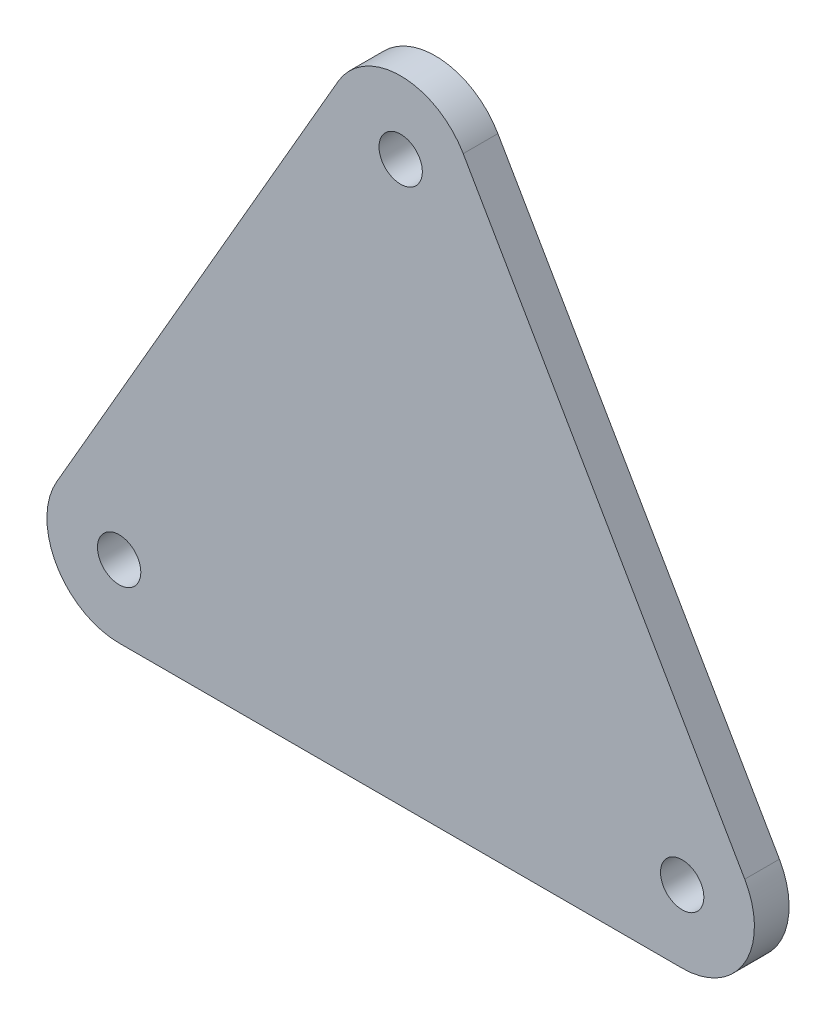
ISO-10303-21;
HEADER;
FILE_DESCRIPTION(('STEP AP214'),'2;1');
FILE_NAME('part.step','',(''),(''),'','','');
FILE_SCHEMA(('AUTOMOTIVE_DESIGN { 1 0 10303 214 1 1 1 1 }'));
ENDSEC;
DATA;
#1=APPLICATION_CONTEXT('core data for automotive mechanical design processes');
#2=APPLICATION_PROTOCOL_DEFINITION('international standard','automotive_design',2000,#1);
#3=PRODUCT_CONTEXT('',#1,'mechanical');
#4=PRODUCT('Part','Part','',(#3));
#5=PRODUCT_RELATED_PRODUCT_CATEGORY('part','',(#4));
#6=PRODUCT_DEFINITION_FORMATION('','',#4);
#7=PRODUCT_DEFINITION_CONTEXT('part definition',#1,'design');
#8=PRODUCT_DEFINITION('design','',#6,#7);
#9=PRODUCT_DEFINITION_SHAPE('','',#8);
#10=(LENGTH_UNIT() NAMED_UNIT(*) SI_UNIT(.MILLI.,.METRE.));
#11=(NAMED_UNIT(*) PLANE_ANGLE_UNIT() SI_UNIT($,.RADIAN.));
#12=(NAMED_UNIT(*) SI_UNIT($,.STERADIAN.) SOLID_ANGLE_UNIT());
#13=UNCERTAINTY_MEASURE_WITH_UNIT(LENGTH_MEASURE(1.E-05),#10,'distance_accuracy_value','');
#14=(GEOMETRIC_REPRESENTATION_CONTEXT(3) GLOBAL_UNCERTAINTY_ASSIGNED_CONTEXT((#13)) GLOBAL_UNIT_ASSIGNED_CONTEXT((#10,
#11,#12)) REPRESENTATION_CONTEXT('',''));
#15=CARTESIAN_POINT('',(0.,0.,0.));
#16=DIRECTION('',(0.,0.,1.));
#17=DIRECTION('',(1.,0.,0.));
#18=AXIS2_PLACEMENT_3D('',#15,#16,#17);
#19=CARTESIAN_POINT('',(-19.4855715851499,-11.25,2.4));
#20=DIRECTION('',(0.,0.,1.));
#21=DIRECTION('',(1.,0.,0.));
#22=AXIS2_PLACEMENT_3D('',#19,#20,#21);
#23=PLANE('',#22);
#24=CARTESIAN_POINT('',(19.4855715851499,-11.25,2.4));
#25=DIRECTION('',(0.,0.,1.));
#26=DIRECTION('',(1.,0.,0.));
#27=AXIS2_PLACEMENT_3D('',#24,#25,#26);
#28=CIRCLE('',#27,1.5000000000001);
#29=CARTESIAN_POINT('',(20.98557158515,-11.25,2.4));
#30=VERTEX_POINT('',#29);
#31=EDGE_CURVE('E187',#30,#30,#28,.T.);
#32=ORIENTED_EDGE('',*,*,#31,.F.);
#33=EDGE_LOOP('',(#32));
#34=FACE_BOUND('',#33,.T.);
#35=CARTESIAN_POINT('',(-19.4855715851499,-11.25,2.4));
#36=DIRECTION('',(0.,0.,1.));
#37=DIRECTION('',(1.,0.,0.));
#38=AXIS2_PLACEMENT_3D('',#35,#36,#37);
#39=CIRCLE('',#38,5.00000000000001);
#40=CARTESIAN_POINT('',(-23.8156986040721,-8.75000000000002,2.4));
#41=VERTEX_POINT('',#40);
#42=CARTESIAN_POINT('',(-19.4855715851499,-16.25,2.4));
#43=VERTEX_POINT('',#42);
#44=EDGE_CURVE('E132',#41,#43,#39,.T.);
#45=ORIENTED_EDGE('',*,*,#44,.T.);
#46=DIRECTION('',(1.,0.,0.));
#47=VECTOR('',#46,1.);
#48=CARTESIAN_POINT('',(-19.4855715851499,-16.25,2.4));
#49=LINE('',#48,#47);
#50=CARTESIAN_POINT('',(19.4855715851499,-16.25,2.4));
#51=VERTEX_POINT('',#50);
#52=EDGE_CURVE('E90',#43,#51,#49,.T.);
#53=ORIENTED_EDGE('',*,*,#52,.T.);
#54=CARTESIAN_POINT('',(19.4855715851499,-11.25,2.4));
#55=DIRECTION('',(0.,0.,1.));
#56=DIRECTION('',(1.,0.,0.));
#57=AXIS2_PLACEMENT_3D('',#54,#55,#56);
#58=CIRCLE('',#57,4.99999999999999);
#59=CARTESIAN_POINT('',(23.8156986040721,-8.75,2.4));
#60=VERTEX_POINT('',#59);
#61=EDGE_CURVE('E103',#51,#60,#58,.T.);
#62=ORIENTED_EDGE('',*,*,#61,.T.);
#63=DIRECTION('',(-0.5,0.866025403784439,0.));
#64=VECTOR('',#63,1.);
#65=CARTESIAN_POINT('',(4.3301270189222,25.,2.4));
#66=LINE('',#65,#64);
#67=CARTESIAN_POINT('',(4.3301270189222,25.,2.4));
#68=VERTEX_POINT('',#67);
#69=EDGE_CURVE('E97',#60,#68,#66,.T.);
#70=ORIENTED_EDGE('',*,*,#69,.T.);
#71=CARTESIAN_POINT('',(0.,22.5,2.4));
#72=DIRECTION('',(0.,0.,1.));
#73=DIRECTION('',(1.,0.,0.));
#74=AXIS2_PLACEMENT_3D('',#71,#72,#73);
#75=CIRCLE('',#74,5.00000000000017);
#76=CARTESIAN_POINT('',(-4.33012701892236,25.,2.4));
#77=VERTEX_POINT('',#76);
#78=EDGE_CURVE('E101',#68,#77,#75,.T.);
#79=ORIENTED_EDGE('',*,*,#78,.T.);
#80=DIRECTION('',(-0.499999999999993,-0.866025403784443,0.));
#81=VECTOR('',#80,1.);
#82=CARTESIAN_POINT('',(-23.8156986040721,-8.75000000000002,2.4));
#83=LINE('',#82,#81);
#84=EDGE_CURVE('E53',#77,#41,#83,.T.);
#85=ORIENTED_EDGE('',*,*,#84,.T.);
#86=EDGE_LOOP('',(#45,#53,#62,#70,#79,#85));
#87=FACE_BOUND('',#86,.T.);
#88=CARTESIAN_POINT('',(0.,22.5,2.4));
#89=DIRECTION('',(0.,0.,1.));
#90=DIRECTION('',(1.,0.,0.));
#91=AXIS2_PLACEMENT_3D('',#88,#89,#90);
#92=CIRCLE('',#91,1.5);
#93=CARTESIAN_POINT('',(1.5,22.5,2.4));
#94=VERTEX_POINT('',#93);
#95=EDGE_CURVE('E125',#94,#94,#92,.T.);
#96=ORIENTED_EDGE('',*,*,#95,.F.);
#97=EDGE_LOOP('',(#96));
#98=FACE_BOUND('',#97,.T.);
#99=CARTESIAN_POINT('',(-19.4855715851499,-11.25,2.4));
#100=DIRECTION('',(0.,0.,1.));
#101=DIRECTION('',(1.,0.,0.));
#102=AXIS2_PLACEMENT_3D('',#99,#100,#101);
#103=CIRCLE('',#102,1.5000000000002);
#104=CARTESIAN_POINT('',(-17.9855715851497,-11.25,2.4));
#105=VERTEX_POINT('',#104);
#106=EDGE_CURVE('E178',#105,#105,#103,.T.);
#107=ORIENTED_EDGE('',*,*,#106,.F.);
#108=EDGE_LOOP('',(#107));
#109=FACE_BOUND('',#108,.T.);
#110=ADVANCED_FACE('F36',(#34,#87,#98,#109),#23,.T.);
#111=CARTESIAN_POINT('',(-19.4855715851499,-11.25,0.));
#112=DIRECTION('',(0.,0.,1.));
#113=DIRECTION('',(1.,0.,0.));
#114=AXIS2_PLACEMENT_3D('',#111,#112,#113);
#115=PLANE('',#114);
#116=CARTESIAN_POINT('',(-19.4855715851499,-11.25,0.));
#117=DIRECTION('',(0.,0.,1.));
#118=DIRECTION('',(1.,0.,0.));
#119=AXIS2_PLACEMENT_3D('',#116,#117,#118);
#120=CIRCLE('',#119,5.00000000000001);
#121=CARTESIAN_POINT('',(-23.8156986040721,-8.75000000000002,0.));
#122=VERTEX_POINT('',#121);
#123=CARTESIAN_POINT('',(-19.4855715851499,-16.25,0.));
#124=VERTEX_POINT('',#123);
#125=EDGE_CURVE('E121',#122,#124,#120,.T.);
#126=ORIENTED_EDGE('',*,*,#125,.F.);
#127=DIRECTION('',(-0.499999999999993,-0.866025403784443,0.));
#128=VECTOR('',#127,1.);
#129=CARTESIAN_POINT('',(-23.8156986040721,-8.75000000000002,0.));
#130=LINE('',#129,#128);
#131=CARTESIAN_POINT('',(-4.33012701892236,25.,0.));
#132=VERTEX_POINT('',#131);
#133=EDGE_CURVE('E82',#132,#122,#130,.T.);
#134=ORIENTED_EDGE('',*,*,#133,.F.);
#135=CARTESIAN_POINT('',(0.,22.5,0.));
#136=DIRECTION('',(0.,0.,1.));
#137=DIRECTION('',(1.,0.,0.));
#138=AXIS2_PLACEMENT_3D('',#135,#136,#137);
#139=CIRCLE('',#138,5.00000000000017);
#140=CARTESIAN_POINT('',(4.3301270189222,25.,0.));
#141=VERTEX_POINT('',#140);
#142=EDGE_CURVE('E76',#141,#132,#139,.T.);
#143=ORIENTED_EDGE('',*,*,#142,.F.);
#144=DIRECTION('',(-0.5,0.866025403784439,0.));
#145=VECTOR('',#144,1.);
#146=CARTESIAN_POINT('',(4.3301270189222,25.,0.));
#147=LINE('',#146,#145);
#148=CARTESIAN_POINT('',(23.8156986040721,-8.75,0.));
#149=VERTEX_POINT('',#148);
#150=EDGE_CURVE('E111',#149,#141,#147,.T.);
#151=ORIENTED_EDGE('',*,*,#150,.F.);
#152=CARTESIAN_POINT('',(19.4855715851499,-11.25,0.));
#153=DIRECTION('',(0.,0.,1.));
#154=DIRECTION('',(1.,0.,0.));
#155=AXIS2_PLACEMENT_3D('',#152,#153,#154);
#156=CIRCLE('',#155,4.99999999999999);
#157=CARTESIAN_POINT('',(19.4855715851499,-16.25,0.));
#158=VERTEX_POINT('',#157);
#159=EDGE_CURVE('E127',#158,#149,#156,.T.);
#160=ORIENTED_EDGE('',*,*,#159,.F.);
#161=DIRECTION('',(1.,0.,0.));
#162=VECTOR('',#161,1.);
#163=CARTESIAN_POINT('',(-19.4855715851499,-16.25,0.));
#164=LINE('',#163,#162);
#165=EDGE_CURVE('E124',#124,#158,#164,.T.);
#166=ORIENTED_EDGE('',*,*,#165,.F.);
#167=EDGE_LOOP('',(#126,#134,#143,#151,#160,#166));
#168=FACE_BOUND('',#167,.T.);
#169=CARTESIAN_POINT('',(0.,22.5,0.));
#170=DIRECTION('',(0.,0.,1.));
#171=DIRECTION('',(1.,0.,0.));
#172=AXIS2_PLACEMENT_3D('',#169,#170,#171);
#173=CIRCLE('',#172,1.5);
#174=CARTESIAN_POINT('',(1.5,22.5,0.));
#175=VERTEX_POINT('',#174);
#176=EDGE_CURVE('E190',#175,#175,#173,.T.);
#177=ORIENTED_EDGE('',*,*,#176,.T.);
#178=EDGE_LOOP('',(#177));
#179=FACE_BOUND('',#178,.T.);
#180=CARTESIAN_POINT('',(19.4855715851499,-11.25,0.));
#181=DIRECTION('',(0.,0.,1.));
#182=DIRECTION('',(1.,0.,0.));
#183=AXIS2_PLACEMENT_3D('',#180,#181,#182);
#184=CIRCLE('',#183,1.5000000000001);
#185=CARTESIAN_POINT('',(20.98557158515,-11.25,0.));
#186=VERTEX_POINT('',#185);
#187=EDGE_CURVE('E184',#186,#186,#184,.T.);
#188=ORIENTED_EDGE('',*,*,#187,.T.);
#189=EDGE_LOOP('',(#188));
#190=FACE_BOUND('',#189,.T.);
#191=CARTESIAN_POINT('',(-19.4855715851499,-11.25,0.));
#192=DIRECTION('',(0.,0.,1.));
#193=DIRECTION('',(1.,0.,0.));
#194=AXIS2_PLACEMENT_3D('',#191,#192,#193);
#195=CIRCLE('',#194,1.5000000000002);
#196=CARTESIAN_POINT('',(-17.9855715851497,-11.25,0.));
#197=VERTEX_POINT('',#196);
#198=EDGE_CURVE('E181',#197,#197,#195,.T.);
#199=ORIENTED_EDGE('',*,*,#198,.T.);
#200=EDGE_LOOP('',(#199));
#201=FACE_BOUND('',#200,.T.);
#202=ADVANCED_FACE('F141',(#168,#179,#190,#201),#115,.F.);
#203=CARTESIAN_POINT('',(-19.4855715851499,-11.25,2.4));
#204=DIRECTION('',(0.,0.,-1.));
#205=DIRECTION('',(-1.,0.,0.));
#206=AXIS2_PLACEMENT_3D('',#203,#204,#205);
#207=CYLINDRICAL_SURFACE('',#206,5.00000000000001);
#208=ORIENTED_EDGE('',*,*,#125,.T.);
#209=DIRECTION('',(0.,0.,-1.));
#210=VECTOR('',#209,1.);
#211=CARTESIAN_POINT('',(-19.4855715851499,-16.25,2.4));
#212=LINE('',#211,#210);
#213=EDGE_CURVE('E11',#43,#124,#212,.T.);
#214=ORIENTED_EDGE('',*,*,#213,.F.);
#215=ORIENTED_EDGE('',*,*,#44,.F.);
#216=DIRECTION('',(0.,0.,-1.));
#217=VECTOR('',#216,1.);
#218=CARTESIAN_POINT('',(-23.8156986040721,-8.75000000000002,2.4));
#219=LINE('',#218,#217);
#220=EDGE_CURVE('E117',#41,#122,#219,.T.);
#221=ORIENTED_EDGE('',*,*,#220,.T.);
#222=EDGE_LOOP('',(#208,#214,#215,#221));
#223=FACE_BOUND('',#222,.T.);
#224=ADVANCED_FACE('F38',(#223),#207,.T.);
#225=CARTESIAN_POINT('',(-19.4855715851499,-16.25,2.4));
#226=DIRECTION('',(0.,1.,0.));
#227=DIRECTION('',(-1.,0.,0.));
#228=AXIS2_PLACEMENT_3D('',#225,#226,#227);
#229=PLANE('',#228);
#230=ORIENTED_EDGE('',*,*,#165,.T.);
#231=DIRECTION('',(0.,0.,-1.));
#232=VECTOR('',#231,1.);
#233=CARTESIAN_POINT('',(19.4855715851499,-16.25,2.4));
#234=LINE('',#233,#232);
#235=EDGE_CURVE('E45',#51,#158,#234,.T.);
#236=ORIENTED_EDGE('',*,*,#235,.F.);
#237=ORIENTED_EDGE('',*,*,#52,.F.);
#238=ORIENTED_EDGE('',*,*,#213,.T.);
#239=EDGE_LOOP('',(#230,#236,#237,#238));
#240=FACE_BOUND('',#239,.T.);
#241=ADVANCED_FACE('F240',(#240),#229,.F.);
#242=CARTESIAN_POINT('',(19.4855715851499,-11.25,2.4));
#243=DIRECTION('',(0.,0.,-1.));
#244=DIRECTION('',(-1.,0.,0.));
#245=AXIS2_PLACEMENT_3D('',#242,#243,#244);
#246=CYLINDRICAL_SURFACE('',#245,4.99999999999999);
#247=ORIENTED_EDGE('',*,*,#159,.T.);
#248=DIRECTION('',(0.,0.,-1.));
#249=VECTOR('',#248,1.);
#250=CARTESIAN_POINT('',(23.8156986040721,-8.75,2.4));
#251=LINE('',#250,#249);
#252=EDGE_CURVE('E112',#60,#149,#251,.T.);
#253=ORIENTED_EDGE('',*,*,#252,.F.);
#254=ORIENTED_EDGE('',*,*,#61,.F.);
#255=ORIENTED_EDGE('',*,*,#235,.T.);
#256=EDGE_LOOP('',(#247,#253,#254,#255));
#257=FACE_BOUND('',#256,.T.);
#258=ADVANCED_FACE('F138',(#257),#246,.T.);
#259=CARTESIAN_POINT('',(4.3301270189222,25.,2.4));
#260=DIRECTION('',(-0.866025403784439,-0.5,0.));
#261=DIRECTION('',(0.5,-0.866025403784439,0.));
#262=AXIS2_PLACEMENT_3D('',#259,#260,#261);
#263=PLANE('',#262);
#264=ORIENTED_EDGE('',*,*,#150,.T.);
#265=DIRECTION('',(0.,0.,-1.));
#266=VECTOR('',#265,1.);
#267=CARTESIAN_POINT('',(4.3301270189222,25.,2.4));
#268=LINE('',#267,#266);
#269=EDGE_CURVE('E108',#68,#141,#268,.T.);
#270=ORIENTED_EDGE('',*,*,#269,.F.);
#271=ORIENTED_EDGE('',*,*,#69,.F.);
#272=ORIENTED_EDGE('',*,*,#252,.T.);
#273=EDGE_LOOP('',(#264,#270,#271,#272));
#274=FACE_BOUND('',#273,.T.);
#275=ADVANCED_FACE('F109',(#274),#263,.F.);
#276=CARTESIAN_POINT('',(0.,22.5,2.4));
#277=DIRECTION('',(0.,0.,-1.));
#278=DIRECTION('',(-1.,0.,0.));
#279=AXIS2_PLACEMENT_3D('',#276,#277,#278);
#280=CYLINDRICAL_SURFACE('',#279,5.00000000000017);
#281=ORIENTED_EDGE('',*,*,#142,.T.);
#282=DIRECTION('',(0.,0.,-1.));
#283=VECTOR('',#282,1.);
#284=CARTESIAN_POINT('',(-4.33012701892236,25.,2.4));
#285=LINE('',#284,#283);
#286=EDGE_CURVE('E113',#77,#132,#285,.T.);
#287=ORIENTED_EDGE('',*,*,#286,.F.);
#288=ORIENTED_EDGE('',*,*,#78,.F.);
#289=ORIENTED_EDGE('',*,*,#269,.T.);
#290=EDGE_LOOP('',(#281,#287,#288,#289));
#291=FACE_BOUND('',#290,.T.);
#292=ADVANCED_FACE('F115',(#291),#280,.T.);
#293=CARTESIAN_POINT('',(-23.8156986040721,-8.75000000000002,2.4));
#294=DIRECTION('',(0.866025403784442,-0.499999999999993,0.));
#295=DIRECTION('',(0.499999999999993,0.866025403784443,0.));
#296=AXIS2_PLACEMENT_3D('',#293,#294,#295);
#297=PLANE('',#296);
#298=ORIENTED_EDGE('',*,*,#133,.T.);
#299=ORIENTED_EDGE('',*,*,#220,.F.);
#300=ORIENTED_EDGE('',*,*,#84,.F.);
#301=ORIENTED_EDGE('',*,*,#286,.T.);
#302=EDGE_LOOP('',(#298,#299,#300,#301));
#303=FACE_BOUND('',#302,.T.);
#304=ADVANCED_FACE('F146',(#303),#297,.F.);
#305=CARTESIAN_POINT('',(0.,22.5,2.4));
#306=DIRECTION('',(0.,0.,-1.));
#307=DIRECTION('',(-1.,0.,0.));
#308=AXIS2_PLACEMENT_3D('',#305,#306,#307);
#309=CYLINDRICAL_SURFACE('',#308,1.5);
#310=ORIENTED_EDGE('',*,*,#95,.T.);
#311=EDGE_LOOP('',(#310));
#312=FACE_BOUND('',#311,.T.);
#313=ORIENTED_EDGE('',*,*,#176,.F.);
#314=EDGE_LOOP('',(#313));
#315=FACE_BOUND('',#314,.T.);
#316=ADVANCED_FACE('F148',(#312,#315),#309,.F.);
#317=CARTESIAN_POINT('',(19.4855715851499,-11.25,2.4));
#318=DIRECTION('',(0.,0.,-1.));
#319=DIRECTION('',(-1.,0.,0.));
#320=AXIS2_PLACEMENT_3D('',#317,#318,#319);
#321=CYLINDRICAL_SURFACE('',#320,1.5000000000001);
#322=ORIENTED_EDGE('',*,*,#31,.T.);
#323=EDGE_LOOP('',(#322));
#324=FACE_BOUND('',#323,.T.);
#325=ORIENTED_EDGE('',*,*,#187,.F.);
#326=EDGE_LOOP('',(#325));
#327=FACE_BOUND('',#326,.T.);
#328=ADVANCED_FACE('F154',(#324,#327),#321,.F.);
#329=CARTESIAN_POINT('',(-19.4855715851499,-11.25,2.4));
#330=DIRECTION('',(0.,0.,-1.));
#331=DIRECTION('',(-1.,0.,0.));
#332=AXIS2_PLACEMENT_3D('',#329,#330,#331);
#333=CYLINDRICAL_SURFACE('',#332,1.5000000000002);
#334=ORIENTED_EDGE('',*,*,#106,.T.);
#335=EDGE_LOOP('',(#334));
#336=FACE_BOUND('',#335,.T.);
#337=ORIENTED_EDGE('',*,*,#198,.F.);
#338=EDGE_LOOP('',(#337));
#339=FACE_BOUND('',#338,.T.);
#340=ADVANCED_FACE('F169',(#336,#339),#333,.F.);
#341=CLOSED_SHELL('',(#110,#202,#224,#241,#258,#275,#292,#304,#316,#328,#340));
#342=MANIFOLD_SOLID_BREP('B2',#341);
#343=ADVANCED_BREP_SHAPE_REPRESENTATION('',(#18,#342),#14);
#344=SHAPE_DEFINITION_REPRESENTATION(#9,#343);
ENDSEC;
END-ISO-10303-21;
